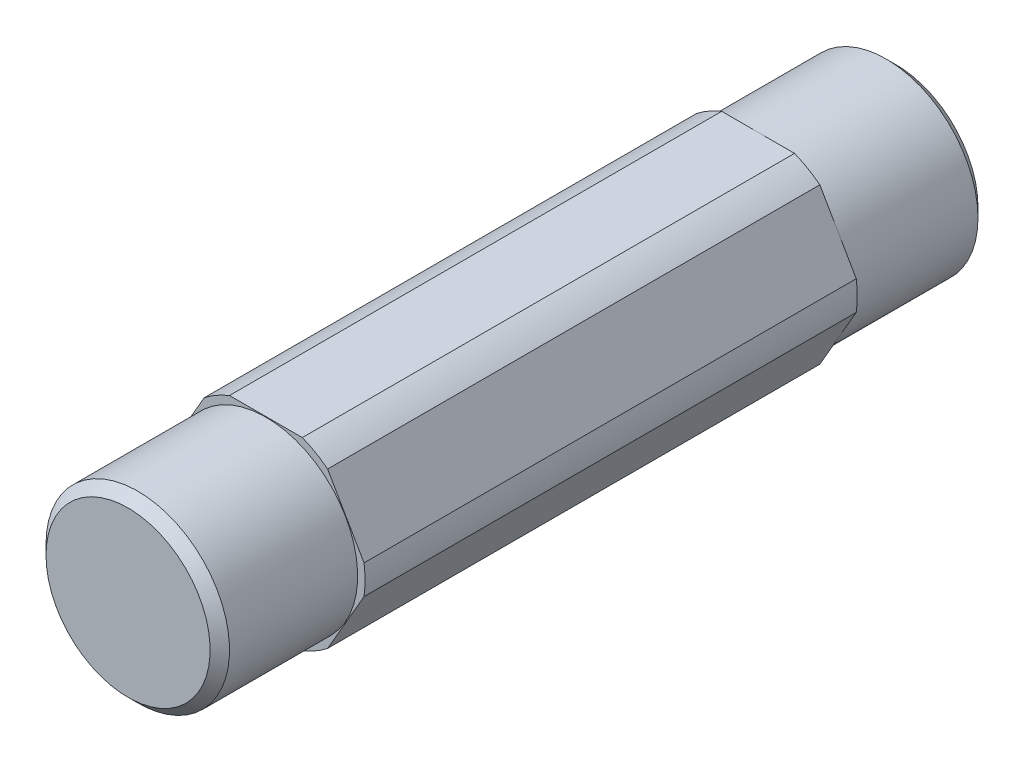
ISO-10303-21;
HEADER;
FILE_DESCRIPTION(('STEP AP214'),'2;1');
FILE_NAME('part.step','',(''),(''),'','','');
FILE_SCHEMA(('AUTOMOTIVE_DESIGN { 1 0 10303 214 1 1 1 1 }'));
ENDSEC;
DATA;
#1=APPLICATION_CONTEXT('core data for automotive mechanical design processes');
#2=APPLICATION_PROTOCOL_DEFINITION('international standard','automotive_design',2000,#1);
#3=PRODUCT_CONTEXT('',#1,'mechanical');
#4=PRODUCT('Part','Part','',(#3));
#5=PRODUCT_RELATED_PRODUCT_CATEGORY('part','',(#4));
#6=PRODUCT_DEFINITION_FORMATION('','',#4);
#7=PRODUCT_DEFINITION_CONTEXT('part definition',#1,'design');
#8=PRODUCT_DEFINITION('design','',#6,#7);
#9=PRODUCT_DEFINITION_SHAPE('','',#8);
#10=(LENGTH_UNIT() NAMED_UNIT(*) SI_UNIT(.MILLI.,.METRE.));
#11=(NAMED_UNIT(*) PLANE_ANGLE_UNIT() SI_UNIT($,.RADIAN.));
#12=(NAMED_UNIT(*) SI_UNIT($,.STERADIAN.) SOLID_ANGLE_UNIT());
#13=UNCERTAINTY_MEASURE_WITH_UNIT(LENGTH_MEASURE(1.E-05),#10,'distance_accuracy_value','');
#14=(GEOMETRIC_REPRESENTATION_CONTEXT(3) GLOBAL_UNCERTAINTY_ASSIGNED_CONTEXT((#13)) GLOBAL_UNIT_ASSIGNED_CONTEXT((#10,
#11,#12)) REPRESENTATION_CONTEXT('',''));
#15=CARTESIAN_POINT('',(0.,0.,0.));
#16=DIRECTION('',(0.,0.,1.));
#17=DIRECTION('',(1.,0.,0.));
#18=AXIS2_PLACEMENT_3D('',#15,#16,#17);
#19=CARTESIAN_POINT('',(0.,0.,19.812));
#20=DIRECTION('',(0.,0.,1.));
#21=DIRECTION('',(1.,0.,0.));
#22=AXIS2_PLACEMENT_3D('',#19,#20,#21);
#23=PLANE('',#22);
#24=CARTESIAN_POINT('',(0.,0.,19.8120000000017));
#25=DIRECTION('',(0.,0.,-1.));
#26=DIRECTION('',(-1.,0.,0.));
#27=AXIS2_PLACEMENT_3D('',#24,#25,#26);
#28=CIRCLE('',#27,4.23500000005106);
#29=CARTESIAN_POINT('',(-4.23500000005106,0.,19.8120000000017));
#30=VERTEX_POINT('',#29);
#31=EDGE_CURVE('E20',#30,#30,#28,.T.);
#32=ORIENTED_EDGE('',*,*,#31,.F.);
#33=EDGE_LOOP('',(#32));
#34=FACE_BOUND('',#33,.T.);
#35=ADVANCED_FACE('F17',(#34),#23,.T.);
#36=CARTESIAN_POINT('',(0.,0.,19.3120000000135));
#37=DIRECTION('',(0.,0.,-1.));
#38=DIRECTION('',(-1.,0.,0.));
#39=AXIS2_PLACEMENT_3D('',#36,#37,#38);
#40=CONICAL_SURFACE('',#39,4.73500000003924,0.785398163397448);
#41=CARTESIAN_POINT('',(0.,0.,19.312));
#42=DIRECTION('',(0.,0.,-1.));
#43=DIRECTION('',(-1.,0.,0.));
#44=AXIS2_PLACEMENT_3D('',#41,#42,#43);
#45=CIRCLE('',#44,4.735);
#46=CARTESIAN_POINT('',(-4.735,0.,19.312));
#47=VERTEX_POINT('',#46);
#48=EDGE_CURVE('E110',#47,#47,#45,.T.);
#49=ORIENTED_EDGE('',*,*,#48,.F.);
#50=EDGE_LOOP('',(#49));
#51=FACE_BOUND('',#50,.T.);
#52=ORIENTED_EDGE('',*,*,#31,.T.);
#53=EDGE_LOOP('',(#52));
#54=FACE_BOUND('',#53,.T.);
#55=ADVANCED_FACE('F408',(#51,#54),#40,.T.);
#56=CARTESIAN_POINT('',(0.,0.,19.812));
#57=DIRECTION('',(0.,0.,-1.));
#58=DIRECTION('',(-1.,0.,0.));
#59=AXIS2_PLACEMENT_3D('',#56,#57,#58);
#60=CYLINDRICAL_SURFACE('',#59,4.735);
#61=CARTESIAN_POINT('',(0.,0.,12.7));
#62=DIRECTION('',(0.,0.,-1.));
#63=DIRECTION('',(-1.,0.,0.));
#64=AXIS2_PLACEMENT_3D('',#61,#62,#63);
#65=CIRCLE('',#64,4.735);
#66=CARTESIAN_POINT('',(-4.735,0.,12.7));
#67=VERTEX_POINT('',#66);
#68=EDGE_CURVE('E201',#67,#67,#65,.T.);
#69=ORIENTED_EDGE('',*,*,#68,.F.);
#70=EDGE_LOOP('',(#69));
#71=FACE_BOUND('',#70,.T.);
#72=ORIENTED_EDGE('',*,*,#48,.T.);
#73=EDGE_LOOP('',(#72));
#74=FACE_BOUND('',#73,.T.);
#75=ADVANCED_FACE('F400',(#71,#74),#60,.T.);
#76=CARTESIAN_POINT('',(0.,0.,-19.812));
#77=DIRECTION('',(0.,0.,1.));
#78=DIRECTION('',(1.,0.,0.));
#79=AXIS2_PLACEMENT_3D('',#76,#77,#78);
#80=CYLINDRICAL_SURFACE('',#79,5.120000047);
#81=DIRECTION('',(0.,0.,1.));
#82=VECTOR('',#81,1.);
#83=CARTESIAN_POINT('',(-3.18463294144494,4.00905394195984,12.7));
#84=LINE('',#83,#82);
#85=CARTESIAN_POINT('',(-3.18463294144494,4.00905394195984,-12.7));
#86=VERTEX_POINT('',#85);
#87=CARTESIAN_POINT('',(-3.18463294144494,4.00905394195984,12.7));
#88=VERTEX_POINT('',#87);
#89=EDGE_CURVE('E104',#86,#88,#84,.T.);
#90=ORIENTED_EDGE('',*,*,#89,.T.);
#91=CARTESIAN_POINT('',(0.,0.,12.7));
#92=DIRECTION('',(0.,0.,1.));
#93=DIRECTION('',(1.,0.,0.));
#94=AXIS2_PLACEMENT_3D('',#91,#92,#93);
#95=CIRCLE('',#94,5.120000047);
#96=CARTESIAN_POINT('',(-1.87962608815689,4.7625,12.7));
#97=VERTEX_POINT('',#96);
#98=EDGE_CURVE('E199',#97,#88,#95,.T.);
#99=ORIENTED_EDGE('',*,*,#98,.F.);
#100=DIRECTION('',(0.,0.,-1.));
#101=VECTOR('',#100,1.);
#102=CARTESIAN_POINT('',(-1.87962608815689,4.7625,12.7));
#103=LINE('',#102,#101);
#104=CARTESIAN_POINT('',(-1.87962608815689,4.7625,-12.7));
#105=VERTEX_POINT('',#104);
#106=EDGE_CURVE('E107',#97,#105,#103,.T.);
#107=ORIENTED_EDGE('',*,*,#106,.T.);
#108=CARTESIAN_POINT('',(0.,0.,-12.7));
#109=DIRECTION('',(0.,0.,1.));
#110=DIRECTION('',(1.,0.,0.));
#111=AXIS2_PLACEMENT_3D('',#108,#109,#110);
#112=CIRCLE('',#111,5.120000047);
#113=EDGE_CURVE('E98',#105,#86,#112,.T.);
#114=ORIENTED_EDGE('',*,*,#113,.T.);
#115=EDGE_LOOP('',(#90,#99,#107,#114));
#116=FACE_BOUND('',#115,.T.);
#117=ADVANCED_FACE('F103',(#116),#80,.T.);
#118=CARTESIAN_POINT('',(0.,0.,-19.812));
#119=DIRECTION('',(0.,0.,1.));
#120=DIRECTION('',(1.,0.,0.));
#121=AXIS2_PLACEMENT_3D('',#118,#119,#120);
#122=CYLINDRICAL_SURFACE('',#121,5.120000047);
#123=DIRECTION('',(0.,0.,1.));
#124=VECTOR('',#123,1.);
#125=CARTESIAN_POINT('',(-5.06425902960184,-0.753446058040161,12.7));
#126=LINE('',#125,#124);
#127=CARTESIAN_POINT('',(-5.06425902960184,-0.753446058040161,-12.7));
#128=VERTEX_POINT('',#127);
#129=CARTESIAN_POINT('',(-5.06425902960184,-0.753446058040161,12.7));
#130=VERTEX_POINT('',#129);
#131=EDGE_CURVE('E158',#128,#130,#126,.T.);
#132=ORIENTED_EDGE('',*,*,#131,.T.);
#133=CARTESIAN_POINT('',(0.,0.,12.7));
#134=DIRECTION('',(0.,0.,1.));
#135=DIRECTION('',(1.,0.,0.));
#136=AXIS2_PLACEMENT_3D('',#133,#134,#135);
#137=CIRCLE('',#136,5.120000047);
#138=CARTESIAN_POINT('',(-5.06425902960184,0.753446058040162,12.7));
#139=VERTEX_POINT('',#138);
#140=EDGE_CURVE('E197',#139,#130,#137,.T.);
#141=ORIENTED_EDGE('',*,*,#140,.F.);
#142=DIRECTION('',(0.,0.,1.));
#143=VECTOR('',#142,1.);
#144=CARTESIAN_POINT('',(-5.06425902960184,0.753446058040161,12.7));
#145=LINE('',#144,#143);
#146=CARTESIAN_POINT('',(-5.06425902960184,0.753446058040161,-12.7));
#147=VERTEX_POINT('',#146);
#148=EDGE_CURVE('E119',#139,#147,#145,.F.);
#149=ORIENTED_EDGE('',*,*,#148,.T.);
#150=CARTESIAN_POINT('',(0.,0.,-12.7));
#151=DIRECTION('',(0.,0.,1.));
#152=DIRECTION('',(1.,0.,0.));
#153=AXIS2_PLACEMENT_3D('',#150,#151,#152);
#154=CIRCLE('',#153,5.120000047);
#155=EDGE_CURVE('E109',#147,#128,#154,.T.);
#156=ORIENTED_EDGE('',*,*,#155,.T.);
#157=EDGE_LOOP('',(#132,#141,#149,#156));
#158=FACE_BOUND('',#157,.T.);
#159=ADVANCED_FACE('F210',(#158),#122,.T.);
#160=CARTESIAN_POINT('',(0.,0.,-19.812));
#161=DIRECTION('',(0.,0.,1.));
#162=DIRECTION('',(1.,0.,0.));
#163=AXIS2_PLACEMENT_3D('',#160,#161,#162);
#164=CYLINDRICAL_SURFACE('',#163,5.120000047);
#165=DIRECTION('',(0.,0.,1.));
#166=VECTOR('',#165,1.);
#167=CARTESIAN_POINT('',(-1.8796260881569,-4.7625,12.7));
#168=LINE('',#167,#166);
#169=CARTESIAN_POINT('',(-1.8796260881569,-4.7625,-12.7));
#170=VERTEX_POINT('',#169);
#171=CARTESIAN_POINT('',(-1.8796260881569,-4.7625,12.7));
#172=VERTEX_POINT('',#171);
#173=EDGE_CURVE('E151',#170,#172,#168,.T.);
#174=ORIENTED_EDGE('',*,*,#173,.T.);
#175=CARTESIAN_POINT('',(0.,0.,12.7));
#176=DIRECTION('',(0.,0.,1.));
#177=DIRECTION('',(1.,0.,0.));
#178=AXIS2_PLACEMENT_3D('',#175,#176,#177);
#179=CIRCLE('',#178,5.120000047);
#180=CARTESIAN_POINT('',(-3.18463294144494,-4.00905394195984,12.7));
#181=VERTEX_POINT('',#180);
#182=EDGE_CURVE('E195',#181,#172,#179,.T.);
#183=ORIENTED_EDGE('',*,*,#182,.F.);
#184=DIRECTION('',(0.,0.,1.));
#185=VECTOR('',#184,1.);
#186=CARTESIAN_POINT('',(-3.18463294144494,-4.00905394195984,12.7));
#187=LINE('',#186,#185);
#188=CARTESIAN_POINT('',(-3.18463294144494,-4.00905394195984,-12.7));
#189=VERTEX_POINT('',#188);
#190=EDGE_CURVE('E161',#181,#189,#187,.F.);
#191=ORIENTED_EDGE('',*,*,#190,.T.);
#192=CARTESIAN_POINT('',(0.,0.,-12.7));
#193=DIRECTION('',(0.,0.,1.));
#194=DIRECTION('',(1.,0.,0.));
#195=AXIS2_PLACEMENT_3D('',#192,#193,#194);
#196=CIRCLE('',#195,5.120000047);
#197=EDGE_CURVE('E206',#189,#170,#196,.T.);
#198=ORIENTED_EDGE('',*,*,#197,.T.);
#199=EDGE_LOOP('',(#174,#183,#191,#198));
#200=FACE_BOUND('',#199,.T.);
#201=ADVANCED_FACE('F219',(#200),#164,.T.);
#202=CARTESIAN_POINT('',(0.,0.,-19.812));
#203=DIRECTION('',(0.,0.,1.));
#204=DIRECTION('',(1.,0.,0.));
#205=AXIS2_PLACEMENT_3D('',#202,#203,#204);
#206=CYLINDRICAL_SURFACE('',#205,5.120000047);
#207=DIRECTION('',(0.,0.,1.));
#208=VECTOR('',#207,1.);
#209=CARTESIAN_POINT('',(3.18463294144494,-4.00905394195985,12.7));
#210=LINE('',#209,#208);
#211=CARTESIAN_POINT('',(3.18463294144494,-4.00905394195985,-12.7));
#212=VERTEX_POINT('',#211);
#213=CARTESIAN_POINT('',(3.18463294144494,-4.00905394195985,12.7));
#214=VERTEX_POINT('',#213);
#215=EDGE_CURVE('E144',#212,#214,#210,.T.);
#216=ORIENTED_EDGE('',*,*,#215,.T.);
#217=CARTESIAN_POINT('',(0.,0.,12.7));
#218=DIRECTION('',(0.,0.,1.));
#219=DIRECTION('',(1.,0.,0.));
#220=AXIS2_PLACEMENT_3D('',#217,#218,#219);
#221=CIRCLE('',#220,5.120000047);
#222=CARTESIAN_POINT('',(1.8796260881569,-4.7625,12.7));
#223=VERTEX_POINT('',#222);
#224=EDGE_CURVE('E193',#223,#214,#221,.T.);
#225=ORIENTED_EDGE('',*,*,#224,.F.);
#226=DIRECTION('',(0.,0.,1.));
#227=VECTOR('',#226,1.);
#228=CARTESIAN_POINT('',(1.8796260881569,-4.7625,12.7));
#229=LINE('',#228,#227);
#230=CARTESIAN_POINT('',(1.8796260881569,-4.7625,-12.7));
#231=VERTEX_POINT('',#230);
#232=EDGE_CURVE('E154',#223,#231,#229,.F.);
#233=ORIENTED_EDGE('',*,*,#232,.T.);
#234=CARTESIAN_POINT('',(0.,0.,-12.7));
#235=DIRECTION('',(0.,0.,1.));
#236=DIRECTION('',(1.,0.,0.));
#237=AXIS2_PLACEMENT_3D('',#234,#235,#236);
#238=CIRCLE('',#237,5.120000047);
#239=EDGE_CURVE('E204',#231,#212,#238,.T.);
#240=ORIENTED_EDGE('',*,*,#239,.T.);
#241=EDGE_LOOP('',(#216,#225,#233,#240));
#242=FACE_BOUND('',#241,.T.);
#243=ADVANCED_FACE('F250',(#242),#206,.T.);
#244=CARTESIAN_POINT('',(5.49926131403118,0.,12.7));
#245=DIRECTION('',(0.,0.,1.));
#246=DIRECTION('',(1.,0.,0.));
#247=AXIS2_PLACEMENT_3D('',#244,#245,#246);
#248=PLANE('',#247);
#249=DIRECTION('',(-0.5,-0.866025403784439,0.));
#250=VECTOR('',#249,1.);
#251=CARTESIAN_POINT('',(2.74963065701559,-4.7625,12.7));
#252=LINE('',#251,#250);
#253=CARTESIAN_POINT('',(5.06425902960184,-0.75344605804015,12.7));
#254=VERTEX_POINT('',#253);
#255=EDGE_CURVE('E150',#214,#254,#252,.F.);
#256=ORIENTED_EDGE('',*,*,#255,.T.);
#257=CARTESIAN_POINT('',(0.,0.,12.7));
#258=DIRECTION('',(0.,0.,1.));
#259=DIRECTION('',(1.,0.,0.));
#260=AXIS2_PLACEMENT_3D('',#257,#258,#259);
#261=CIRCLE('',#260,5.120000047);
#262=CARTESIAN_POINT('',(5.06425902960184,0.753446058040151,12.7));
#263=VERTEX_POINT('',#262);
#264=EDGE_CURVE('E181',#263,#254,#261,.F.);
#265=ORIENTED_EDGE('',*,*,#264,.F.);
#266=DIRECTION('',(0.5,-0.866025403784439,0.));
#267=VECTOR('',#266,1.);
#268=CARTESIAN_POINT('',(5.49926131403118,0.,12.7));
#269=LINE('',#268,#267);
#270=CARTESIAN_POINT('',(3.18463294144493,4.00905394195985,12.7));
#271=VERTEX_POINT('',#270);
#272=EDGE_CURVE('E143',#263,#271,#269,.F.);
#273=ORIENTED_EDGE('',*,*,#272,.T.);
#274=CARTESIAN_POINT('',(0.,0.,12.7));
#275=DIRECTION('',(0.,0.,1.));
#276=DIRECTION('',(1.,0.,0.));
#277=AXIS2_PLACEMENT_3D('',#274,#275,#276);
#278=CIRCLE('',#277,5.120000047);
#279=CARTESIAN_POINT('',(1.87962608815689,4.7625,12.7));
#280=VERTEX_POINT('',#279);
#281=EDGE_CURVE('E189',#280,#271,#278,.F.);
#282=ORIENTED_EDGE('',*,*,#281,.F.);
#283=DIRECTION('',(1.,0.,0.));
#284=VECTOR('',#283,1.);
#285=CARTESIAN_POINT('',(2.74963065701559,4.7625,12.7));
#286=LINE('',#285,#284);
#287=EDGE_CURVE('E169',#280,#97,#286,.F.);
#288=ORIENTED_EDGE('',*,*,#287,.T.);
#289=ORIENTED_EDGE('',*,*,#98,.T.);
#290=DIRECTION('',(0.5,0.866025403784439,0.));
#291=VECTOR('',#290,1.);
#292=CARTESIAN_POINT('',(-2.74963065701559,4.7625,12.7));
#293=LINE('',#292,#291);
#294=EDGE_CURVE('E117',#88,#139,#293,.F.);
#295=ORIENTED_EDGE('',*,*,#294,.T.);
#296=ORIENTED_EDGE('',*,*,#140,.T.);
#297=DIRECTION('',(-0.5,0.866025403784439,0.));
#298=VECTOR('',#297,1.);
#299=CARTESIAN_POINT('',(-5.49926131403119,0.,12.7));
#300=LINE('',#299,#298);
#301=EDGE_CURVE('E118',#130,#181,#300,.F.);
#302=ORIENTED_EDGE('',*,*,#301,.T.);
#303=ORIENTED_EDGE('',*,*,#182,.T.);
#304=DIRECTION('',(1.,0.,0.));
#305=VECTOR('',#304,1.);
#306=CARTESIAN_POINT('',(-2.74963065701559,-4.7625,12.7));
#307=LINE('',#306,#305);
#308=EDGE_CURVE('E157',#172,#223,#307,.T.);
#309=ORIENTED_EDGE('',*,*,#308,.T.);
#310=ORIENTED_EDGE('',*,*,#224,.T.);
#311=EDGE_LOOP('',(#256,#265,#273,#282,#288,#289,#295,#296,#302,#303,#309,#310));
#312=FACE_BOUND('',#311,.T.);
#313=ORIENTED_EDGE('',*,*,#68,.T.);
#314=EDGE_LOOP('',(#313));
#315=FACE_BOUND('',#314,.T.);
#316=ADVANCED_FACE('F222',(#312,#315),#248,.T.);
#317=CARTESIAN_POINT('',(0.,0.,-19.812));
#318=DIRECTION('',(0.,0.,1.));
#319=DIRECTION('',(1.,0.,0.));
#320=AXIS2_PLACEMENT_3D('',#317,#318,#319);
#321=CYLINDRICAL_SURFACE('',#320,5.120000047);
#322=DIRECTION('',(0.,0.,-1.));
#323=VECTOR('',#322,1.);
#324=CARTESIAN_POINT('',(1.87962608815689,4.7625,12.7));
#325=LINE('',#324,#323);
#326=CARTESIAN_POINT('',(1.87962608815689,4.7625,-12.7));
#327=VERTEX_POINT('',#326);
#328=EDGE_CURVE('E165',#327,#280,#325,.F.);
#329=ORIENTED_EDGE('',*,*,#328,.T.);
#330=ORIENTED_EDGE('',*,*,#281,.T.);
#331=DIRECTION('',(0.,0.,1.));
#332=VECTOR('',#331,1.);
#333=CARTESIAN_POINT('',(3.18463294144493,4.00905394195985,12.7));
#334=LINE('',#333,#332);
#335=CARTESIAN_POINT('',(3.18463294144493,4.00905394195985,-12.7));
#336=VERTEX_POINT('',#335);
#337=EDGE_CURVE('E141',#271,#336,#334,.F.);
#338=ORIENTED_EDGE('',*,*,#337,.T.);
#339=CARTESIAN_POINT('',(0.,0.,-12.7));
#340=DIRECTION('',(0.,0.,1.));
#341=DIRECTION('',(1.,0.,0.));
#342=AXIS2_PLACEMENT_3D('',#339,#340,#341);
#343=CIRCLE('',#342,5.120000047);
#344=EDGE_CURVE('E35',#336,#327,#343,.T.);
#345=ORIENTED_EDGE('',*,*,#344,.T.);
#346=EDGE_LOOP('',(#329,#330,#338,#345));
#347=FACE_BOUND('',#346,.T.);
#348=ADVANCED_FACE('F230',(#347),#321,.T.);
#349=CARTESIAN_POINT('',(0.,0.,-19.812));
#350=DIRECTION('',(0.,0.,1.));
#351=DIRECTION('',(1.,0.,0.));
#352=AXIS2_PLACEMENT_3D('',#349,#350,#351);
#353=CYLINDRICAL_SURFACE('',#352,5.120000047);
#354=DIRECTION('',(0.,0.,1.));
#355=VECTOR('',#354,1.);
#356=CARTESIAN_POINT('',(5.06425902960184,0.75344605804015,12.7));
#357=LINE('',#356,#355);
#358=CARTESIAN_POINT('',(5.06425902960184,0.753446058040151,-12.7));
#359=VERTEX_POINT('',#358);
#360=EDGE_CURVE('E138',#359,#263,#357,.T.);
#361=ORIENTED_EDGE('',*,*,#360,.T.);
#362=ORIENTED_EDGE('',*,*,#264,.T.);
#363=DIRECTION('',(0.,0.,1.));
#364=VECTOR('',#363,1.);
#365=CARTESIAN_POINT('',(5.06425902960184,-0.753446058040147,12.7));
#366=LINE('',#365,#364);
#367=CARTESIAN_POINT('',(5.06425902960184,-0.753446058040148,-12.7));
#368=VERTEX_POINT('',#367);
#369=EDGE_CURVE('E147',#254,#368,#366,.F.);
#370=ORIENTED_EDGE('',*,*,#369,.T.);
#371=CARTESIAN_POINT('',(0.,0.,-12.7));
#372=DIRECTION('',(0.,0.,1.));
#373=DIRECTION('',(1.,0.,0.));
#374=AXIS2_PLACEMENT_3D('',#371,#372,#373);
#375=CIRCLE('',#374,5.120000047);
#376=EDGE_CURVE('E187',#368,#359,#375,.T.);
#377=ORIENTED_EDGE('',*,*,#376,.T.);
#378=EDGE_LOOP('',(#361,#362,#370,#377));
#379=FACE_BOUND('',#378,.T.);
#380=ADVANCED_FACE('F255',(#379),#353,.T.);
#381=CARTESIAN_POINT('',(0.,0.,-19.812));
#382=DIRECTION('',(0.,0.,-1.));
#383=DIRECTION('',(-1.,0.,0.));
#384=AXIS2_PLACEMENT_3D('',#381,#382,#383);
#385=PLANE('',#384);
#386=CARTESIAN_POINT('',(0.,0.,-19.8120000000017));
#387=DIRECTION('',(0.,0.,1.));
#388=DIRECTION('',(1.,0.,0.));
#389=AXIS2_PLACEMENT_3D('',#386,#387,#388);
#390=CIRCLE('',#389,4.23500000005106);
#391=CARTESIAN_POINT('',(4.23500000005106,0.,-19.8120000000017));
#392=VERTEX_POINT('',#391);
#393=EDGE_CURVE('E131',#392,#392,#390,.T.);
#394=ORIENTED_EDGE('',*,*,#393,.F.);
#395=EDGE_LOOP('',(#394));
#396=FACE_BOUND('',#395,.T.);
#397=ADVANCED_FACE('F257',(#396),#385,.T.);
#398=CARTESIAN_POINT('',(2.74963065701559,4.7625,12.7));
#399=DIRECTION('',(0.,-1.,0.));
#400=DIRECTION('',(0.,0.,-1.));
#401=AXIS2_PLACEMENT_3D('',#398,#399,#400);
#402=PLANE('',#401);
#403=DIRECTION('',(1.,0.,0.));
#404=VECTOR('',#403,1.);
#405=CARTESIAN_POINT('',(5.49926131403118,4.7625,-12.7));
#406=LINE('',#405,#404);
#407=EDGE_CURVE('E126',#327,#105,#406,.F.);
#408=ORIENTED_EDGE('',*,*,#407,.T.);
#409=ORIENTED_EDGE('',*,*,#106,.F.);
#410=ORIENTED_EDGE('',*,*,#287,.F.);
#411=ORIENTED_EDGE('',*,*,#328,.F.);
#412=EDGE_LOOP('',(#408,#409,#410,#411));
#413=FACE_BOUND('',#412,.T.);
#414=ADVANCED_FACE('F228',(#413),#402,.F.);
#415=CARTESIAN_POINT('',(-2.74963065701559,4.7625,12.7));
#416=DIRECTION('',(0.866025403784439,-0.5,0.));
#417=DIRECTION('',(0.5,0.866025403784439,0.));
#418=AXIS2_PLACEMENT_3D('',#415,#416,#417);
#419=PLANE('',#418);
#420=DIRECTION('',(-0.5,-0.866025403784439,0.));
#421=VECTOR('',#420,1.);
#422=CARTESIAN_POINT('',(-3.18463294144494,4.00905394195984,-12.7));
#423=LINE('',#422,#421);
#424=EDGE_CURVE('E115',#86,#147,#423,.T.);
#425=ORIENTED_EDGE('',*,*,#424,.T.);
#426=ORIENTED_EDGE('',*,*,#148,.F.);
#427=ORIENTED_EDGE('',*,*,#294,.F.);
#428=ORIENTED_EDGE('',*,*,#89,.F.);
#429=EDGE_LOOP('',(#425,#426,#427,#428));
#430=FACE_BOUND('',#429,.T.);
#431=ADVANCED_FACE('F113',(#430),#419,.F.);
#432=CARTESIAN_POINT('',(-5.49926131403119,0.,12.7));
#433=DIRECTION('',(0.866025403784439,0.5,0.));
#434=DIRECTION('',(-0.5,0.866025403784439,0.));
#435=AXIS2_PLACEMENT_3D('',#432,#433,#434);
#436=PLANE('',#435);
#437=DIRECTION('',(0.5,-0.866025403784439,0.));
#438=VECTOR('',#437,1.);
#439=CARTESIAN_POINT('',(-5.06425902960184,-0.753446058040161,-12.7));
#440=LINE('',#439,#438);
#441=EDGE_CURVE('E125',#128,#189,#440,.T.);
#442=ORIENTED_EDGE('',*,*,#441,.T.);
#443=ORIENTED_EDGE('',*,*,#190,.F.);
#444=ORIENTED_EDGE('',*,*,#301,.F.);
#445=ORIENTED_EDGE('',*,*,#131,.F.);
#446=EDGE_LOOP('',(#442,#443,#444,#445));
#447=FACE_BOUND('',#446,.T.);
#448=ADVANCED_FACE('F213',(#447),#436,.F.);
#449=CARTESIAN_POINT('',(-2.74963065701559,-4.7625,12.7));
#450=DIRECTION('',(0.,1.,0.));
#451=DIRECTION('',(0.,0.,1.));
#452=AXIS2_PLACEMENT_3D('',#449,#450,#451);
#453=PLANE('',#452);
#454=DIRECTION('',(1.,0.,0.));
#455=VECTOR('',#454,1.);
#456=CARTESIAN_POINT('',(5.49926131403118,-4.7625,-12.7));
#457=LINE('',#456,#455);
#458=EDGE_CURVE('E129',#170,#231,#457,.T.);
#459=ORIENTED_EDGE('',*,*,#458,.T.);
#460=ORIENTED_EDGE('',*,*,#232,.F.);
#461=ORIENTED_EDGE('',*,*,#308,.F.);
#462=ORIENTED_EDGE('',*,*,#173,.F.);
#463=EDGE_LOOP('',(#459,#460,#461,#462));
#464=FACE_BOUND('',#463,.T.);
#465=ADVANCED_FACE('F245',(#464),#453,.F.);
#466=CARTESIAN_POINT('',(2.74963065701559,-4.7625,12.7));
#467=DIRECTION('',(-0.866025403784439,0.5,0.));
#468=DIRECTION('',(-0.5,-0.866025403784439,0.));
#469=AXIS2_PLACEMENT_3D('',#466,#467,#468);
#470=PLANE('',#469);
#471=DIRECTION('',(0.5,0.866025403784439,0.));
#472=VECTOR('',#471,1.);
#473=CARTESIAN_POINT('',(3.18463294144493,-4.00905394195985,-12.7));
#474=LINE('',#473,#472);
#475=EDGE_CURVE('E239',#212,#368,#474,.T.);
#476=ORIENTED_EDGE('',*,*,#475,.T.);
#477=ORIENTED_EDGE('',*,*,#369,.F.);
#478=ORIENTED_EDGE('',*,*,#255,.F.);
#479=ORIENTED_EDGE('',*,*,#215,.F.);
#480=EDGE_LOOP('',(#476,#477,#478,#479));
#481=FACE_BOUND('',#480,.T.);
#482=ADVANCED_FACE('F253',(#481),#470,.F.);
#483=CARTESIAN_POINT('',(5.49926131403118,0.,12.7));
#484=DIRECTION('',(-0.866025403784439,-0.5,0.));
#485=DIRECTION('',(0.5,-0.866025403784439,0.));
#486=AXIS2_PLACEMENT_3D('',#483,#484,#485);
#487=PLANE('',#486);
#488=DIRECTION('',(-0.5,0.866025403784439,0.));
#489=VECTOR('',#488,1.);
#490=CARTESIAN_POINT('',(5.06425902960184,0.753446058040151,-12.7));
#491=LINE('',#490,#489);
#492=EDGE_CURVE('E137',#359,#336,#491,.T.);
#493=ORIENTED_EDGE('',*,*,#492,.T.);
#494=ORIENTED_EDGE('',*,*,#337,.F.);
#495=ORIENTED_EDGE('',*,*,#272,.F.);
#496=ORIENTED_EDGE('',*,*,#360,.F.);
#497=EDGE_LOOP('',(#493,#494,#495,#496));
#498=FACE_BOUND('',#497,.T.);
#499=ADVANCED_FACE('F238',(#498),#487,.F.);
#500=CARTESIAN_POINT('',(0.,0.,-19.3120000000135));
#501=DIRECTION('',(0.,0.,1.));
#502=DIRECTION('',(1.,0.,0.));
#503=AXIS2_PLACEMENT_3D('',#500,#501,#502);
#504=CONICAL_SURFACE('',#503,4.73500000003924,0.785398163397448);
#505=CARTESIAN_POINT('',(0.,0.,-19.312));
#506=DIRECTION('',(0.,0.,1.));
#507=DIRECTION('',(1.,0.,0.));
#508=AXIS2_PLACEMENT_3D('',#505,#506,#507);
#509=CIRCLE('',#508,4.735);
#510=CARTESIAN_POINT('',(4.735,0.,-19.312));
#511=VERTEX_POINT('',#510);
#512=EDGE_CURVE('E26',#511,#511,#509,.T.);
#513=ORIENTED_EDGE('',*,*,#512,.F.);
#514=EDGE_LOOP('',(#513));
#515=FACE_BOUND('',#514,.T.);
#516=ORIENTED_EDGE('',*,*,#393,.T.);
#517=EDGE_LOOP('',(#516));
#518=FACE_BOUND('',#517,.T.);
#519=ADVANCED_FACE('F274',(#515,#518),#504,.T.);
#520=CARTESIAN_POINT('',(5.49926131403118,0.,-12.7));
#521=DIRECTION('',(0.,0.,1.));
#522=DIRECTION('',(1.,0.,0.));
#523=AXIS2_PLACEMENT_3D('',#520,#521,#522);
#524=PLANE('',#523);
#525=ORIENTED_EDGE('',*,*,#492,.F.);
#526=ORIENTED_EDGE('',*,*,#376,.F.);
#527=ORIENTED_EDGE('',*,*,#475,.F.);
#528=ORIENTED_EDGE('',*,*,#239,.F.);
#529=ORIENTED_EDGE('',*,*,#458,.F.);
#530=ORIENTED_EDGE('',*,*,#197,.F.);
#531=ORIENTED_EDGE('',*,*,#441,.F.);
#532=ORIENTED_EDGE('',*,*,#155,.F.);
#533=ORIENTED_EDGE('',*,*,#424,.F.);
#534=ORIENTED_EDGE('',*,*,#113,.F.);
#535=ORIENTED_EDGE('',*,*,#407,.F.);
#536=ORIENTED_EDGE('',*,*,#344,.F.);
#537=EDGE_LOOP('',(#525,#526,#527,#528,#529,#530,#531,#532,#533,#534,#535,#536));
#538=FACE_BOUND('',#537,.T.);
#539=CARTESIAN_POINT('',(0.,0.,-12.7));
#540=DIRECTION('',(0.,0.,1.));
#541=DIRECTION('',(1.,0.,0.));
#542=AXIS2_PLACEMENT_3D('',#539,#540,#541);
#543=CIRCLE('',#542,4.735);
#544=CARTESIAN_POINT('',(4.735,0.,-12.7));
#545=VERTEX_POINT('',#544);
#546=EDGE_CURVE('E11',#545,#545,#543,.F.);
#547=ORIENTED_EDGE('',*,*,#546,.F.);
#548=EDGE_LOOP('',(#547));
#549=FACE_BOUND('',#548,.T.);
#550=ADVANCED_FACE('F121',(#538,#549),#524,.F.);
#551=CARTESIAN_POINT('',(0.,0.,-19.812));
#552=DIRECTION('',(0.,0.,1.));
#553=DIRECTION('',(1.,0.,0.));
#554=AXIS2_PLACEMENT_3D('',#551,#552,#553);
#555=CYLINDRICAL_SURFACE('',#554,4.735);
#556=ORIENTED_EDGE('',*,*,#546,.T.);
#557=EDGE_LOOP('',(#556));
#558=FACE_BOUND('',#557,.T.);
#559=ORIENTED_EDGE('',*,*,#512,.T.);
#560=EDGE_LOOP('',(#559));
#561=FACE_BOUND('',#560,.T.);
#562=ADVANCED_FACE('F267',(#558,#561),#555,.T.);
#563=CLOSED_SHELL('',(#35,#55,#75,#117,#159,#201,#243,#316,#348,#380,#397,#414,#431,#448,#465,
#482,#499,#519,#550,#562));
#564=MANIFOLD_SOLID_BREP('B1',#563);
#565=ADVANCED_BREP_SHAPE_REPRESENTATION('',(#18,#564),#14);
#566=SHAPE_DEFINITION_REPRESENTATION(#9,#565);
ENDSEC;
END-ISO-10303-21;
